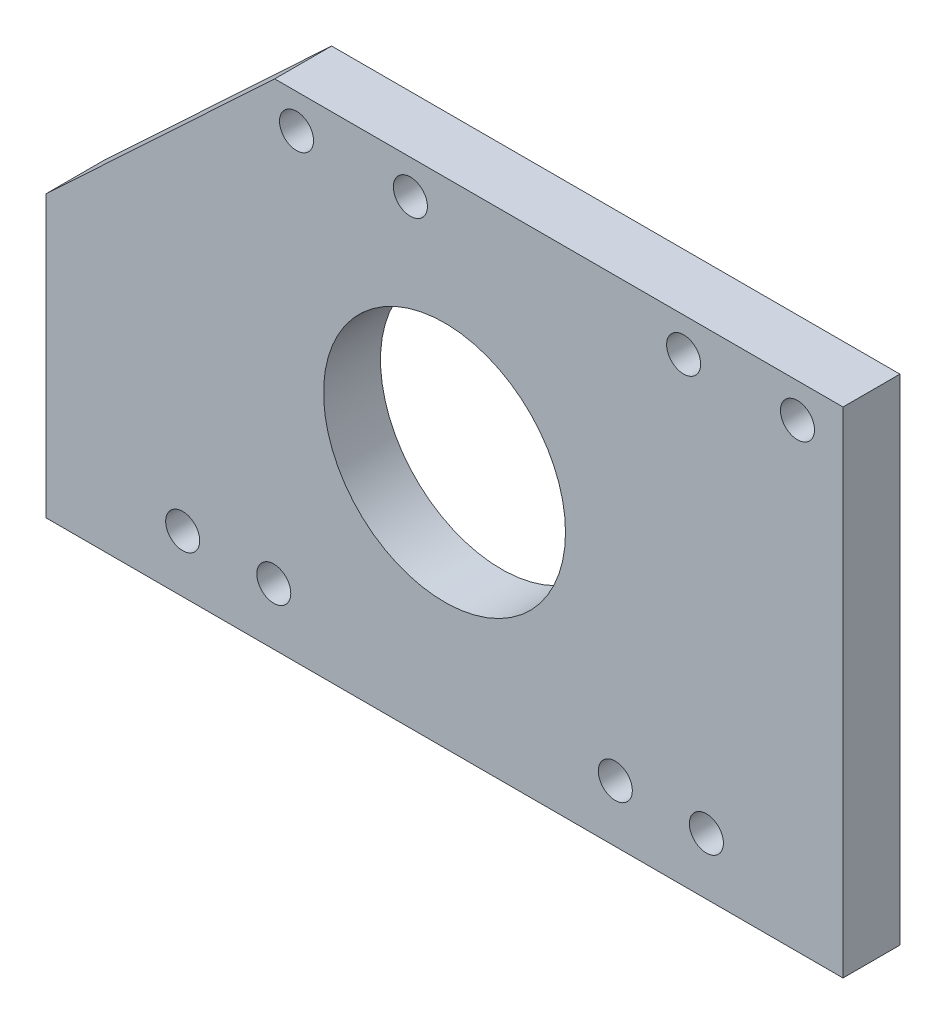
ISO-10303-21;
HEADER;
FILE_DESCRIPTION(('STEP AP214'),'2;1');
FILE_NAME('part.step','',(''),(''),'','','');
FILE_SCHEMA(('AUTOMOTIVE_DESIGN { 1 0 10303 214 1 1 1 1 }'));
ENDSEC;
DATA;
#1=APPLICATION_CONTEXT('core data for automotive mechanical design processes');
#2=APPLICATION_PROTOCOL_DEFINITION('international standard','automotive_design',2000,#1);
#3=PRODUCT_CONTEXT('',#1,'mechanical');
#4=PRODUCT('Part','Part','',(#3));
#5=PRODUCT_RELATED_PRODUCT_CATEGORY('part','',(#4));
#6=PRODUCT_DEFINITION_FORMATION('','',#4);
#7=PRODUCT_DEFINITION_CONTEXT('part definition',#1,'design');
#8=PRODUCT_DEFINITION('design','',#6,#7);
#9=PRODUCT_DEFINITION_SHAPE('','',#8);
#10=(LENGTH_UNIT() NAMED_UNIT(*) SI_UNIT(.MILLI.,.METRE.));
#11=(NAMED_UNIT(*) PLANE_ANGLE_UNIT() SI_UNIT($,.RADIAN.));
#12=(NAMED_UNIT(*) SI_UNIT($,.STERADIAN.) SOLID_ANGLE_UNIT());
#13=UNCERTAINTY_MEASURE_WITH_UNIT(LENGTH_MEASURE(1.E-05),#10,'distance_accuracy_value','');
#14=(GEOMETRIC_REPRESENTATION_CONTEXT(3) GLOBAL_UNCERTAINTY_ASSIGNED_CONTEXT((#13)) GLOBAL_UNIT_ASSIGNED_CONTEXT((#10,
#11,#12)) REPRESENTATION_CONTEXT('',''));
#15=CARTESIAN_POINT('',(0.,0.,0.));
#16=DIRECTION('',(0.,0.,1.));
#17=DIRECTION('',(1.,0.,0.));
#18=AXIS2_PLACEMENT_3D('',#15,#16,#17);
#19=CARTESIAN_POINT('',(-127.,0.,6.35));
#20=DIRECTION('',(-1.,0.,0.));
#21=DIRECTION('',(0.,0.,1.));
#22=AXIS2_PLACEMENT_3D('',#19,#20,#21);
#23=PLANE('',#22);
#24=DIRECTION('',(0.,0.,1.));
#25=VECTOR('',#24,1.);
#26=CARTESIAN_POINT('',(-127.,3.73361875617917,0.));
#27=LINE('',#26,#25);
#28=CARTESIAN_POINT('',(-127.,3.73361875617917,0.));
#29=VERTEX_POINT('',#28);
#30=CARTESIAN_POINT('',(-127.,3.73361875617917,6.35));
#31=VERTEX_POINT('',#30);
#32=EDGE_CURVE('E82',#29,#31,#27,.T.);
#33=ORIENTED_EDGE('',*,*,#32,.F.);
#34=DIRECTION('',(0.,1.,0.));
#35=VECTOR('',#34,1.);
#36=CARTESIAN_POINT('',(-127.,0.,0.));
#37=LINE('',#36,#35);
#38=CARTESIAN_POINT('',(-127.,-27.58186,0.));
#39=VERTEX_POINT('',#38);
#40=EDGE_CURVE('E94',#39,#29,#37,.T.);
#41=ORIENTED_EDGE('',*,*,#40,.F.);
#42=DIRECTION('',(0.,0.,-1.));
#43=VECTOR('',#42,1.);
#44=CARTESIAN_POINT('',(-127.,-27.58186,6.35));
#45=LINE('',#44,#43);
#46=CARTESIAN_POINT('',(-127.,-27.58186,6.35));
#47=VERTEX_POINT('',#46);
#48=EDGE_CURVE('E11',#47,#39,#45,.T.);
#49=ORIENTED_EDGE('',*,*,#48,.F.);
#50=DIRECTION('',(0.,1.,0.));
#51=VECTOR('',#50,1.);
#52=CARTESIAN_POINT('',(-127.,0.,6.35));
#53=LINE('',#52,#51);
#54=EDGE_CURVE('E96',#47,#31,#53,.T.);
#55=ORIENTED_EDGE('',*,*,#54,.T.);
#56=EDGE_LOOP('',(#33,#41,#49,#55));
#57=FACE_BOUND('',#56,.T.);
#58=ADVANCED_FACE('F35',(#57),#23,.T.);
#59=CARTESIAN_POINT('',(0.,-27.58186,6.35));
#60=DIRECTION('',(0.,-1.,0.));
#61=DIRECTION('',(1.,0.,0.));
#62=AXIS2_PLACEMENT_3D('',#59,#60,#61);
#63=PLANE('',#62);
#64=DIRECTION('',(0.,0.,1.));
#65=VECTOR('',#64,1.);
#66=CARTESIAN_POINT('',(-38.0999999999999,-27.58186,0.));
#67=LINE('',#66,#65);
#68=CARTESIAN_POINT('',(-38.0999999999999,-27.58186,0.));
#69=VERTEX_POINT('',#68);
#70=CARTESIAN_POINT('',(-38.0999999999999,-27.58186,6.35));
#71=VERTEX_POINT('',#70);
#72=EDGE_CURVE('E58',#69,#71,#67,.T.);
#73=ORIENTED_EDGE('',*,*,#72,.T.);
#74=DIRECTION('',(-1.,0.,0.));
#75=VECTOR('',#74,1.);
#76=CARTESIAN_POINT('',(0.,-27.58186,6.35));
#77=LINE('',#76,#75);
#78=EDGE_CURVE('E116',#71,#47,#77,.T.);
#79=ORIENTED_EDGE('',*,*,#78,.T.);
#80=ORIENTED_EDGE('',*,*,#48,.T.);
#81=DIRECTION('',(-1.,0.,0.));
#82=VECTOR('',#81,1.);
#83=CARTESIAN_POINT('',(0.,-27.58186,0.));
#84=LINE('',#83,#82);
#85=EDGE_CURVE('E100',#69,#39,#84,.T.);
#86=ORIENTED_EDGE('',*,*,#85,.F.);
#87=EDGE_LOOP('',(#73,#79,#80,#86));
#88=FACE_BOUND('',#87,.T.);
#89=ADVANCED_FACE('F180',(#88),#63,.T.);
#90=CARTESIAN_POINT('',(-82.5499999999999,0.,6.35));
#91=DIRECTION('',(0.,0.,-1.));
#92=DIRECTION('',(-1.,0.,0.));
#93=AXIS2_PLACEMENT_3D('',#90,#91,#92);
#94=CYLINDRICAL_SURFACE('',#93,13.49375);
#95=CARTESIAN_POINT('',(-82.5499999999999,0.,6.35));
#96=DIRECTION('',(0.,0.,1.));
#97=DIRECTION('',(1.,0.,0.));
#98=AXIS2_PLACEMENT_3D('',#95,#96,#97);
#99=CIRCLE('',#98,13.49375);
#100=CARTESIAN_POINT('',(-69.0562499999999,0.,6.35));
#101=VERTEX_POINT('',#100);
#102=EDGE_CURVE('E109',#101,#101,#99,.T.);
#103=ORIENTED_EDGE('',*,*,#102,.T.);
#104=EDGE_LOOP('',(#103));
#105=FACE_BOUND('',#104,.T.);
#106=CARTESIAN_POINT('',(-82.5499999999999,0.,0.));
#107=DIRECTION('',(0.,0.,1.));
#108=DIRECTION('',(1.,0.,0.));
#109=AXIS2_PLACEMENT_3D('',#106,#107,#108);
#110=CIRCLE('',#109,13.49375);
#111=CARTESIAN_POINT('',(-69.0562499999999,0.,0.));
#112=VERTEX_POINT('',#111);
#113=EDGE_CURVE('E101',#112,#112,#110,.T.);
#114=ORIENTED_EDGE('',*,*,#113,.F.);
#115=EDGE_LOOP('',(#114));
#116=FACE_BOUND('',#115,.T.);
#117=ADVANCED_FACE('F37',(#105,#116),#94,.F.);
#118=CARTESIAN_POINT('',(0.,27.58186,6.35));
#119=DIRECTION('',(0.,-1.,0.));
#120=DIRECTION('',(1.,0.,0.));
#121=AXIS2_PLACEMENT_3D('',#118,#119,#120);
#122=PLANE('',#121);
#123=DIRECTION('',(-1.,0.,0.));
#124=VECTOR('',#123,1.);
#125=CARTESIAN_POINT('',(0.,27.58186,0.));
#126=LINE('',#125,#124);
#127=CARTESIAN_POINT('',(-38.0999999999999,27.58186,0.));
#128=VERTEX_POINT('',#127);
#129=CARTESIAN_POINT('',(-101.496237284209,27.58186,0.));
#130=VERTEX_POINT('',#129);
#131=EDGE_CURVE('E103',#128,#130,#126,.T.);
#132=ORIENTED_EDGE('',*,*,#131,.T.);
#133=DIRECTION('',(0.,0.,1.));
#134=VECTOR('',#133,1.);
#135=CARTESIAN_POINT('',(-101.496237284209,27.58186,0.));
#136=LINE('',#135,#134);
#137=CARTESIAN_POINT('',(-101.496237284209,27.58186,6.35));
#138=VERTEX_POINT('',#137);
#139=EDGE_CURVE('E50',#130,#138,#136,.T.);
#140=ORIENTED_EDGE('',*,*,#139,.T.);
#141=DIRECTION('',(-1.,0.,0.));
#142=VECTOR('',#141,1.);
#143=CARTESIAN_POINT('',(0.,27.58186,6.35));
#144=LINE('',#143,#142);
#145=CARTESIAN_POINT('',(-38.0999999999999,27.58186,6.35));
#146=VERTEX_POINT('',#145);
#147=EDGE_CURVE('E43',#146,#138,#144,.T.);
#148=ORIENTED_EDGE('',*,*,#147,.F.);
#149=DIRECTION('',(0.,0.,1.));
#150=VECTOR('',#149,1.);
#151=CARTESIAN_POINT('',(-38.0999999999999,27.58186,0.));
#152=LINE('',#151,#150);
#153=EDGE_CURVE('E130',#128,#146,#152,.T.);
#154=ORIENTED_EDGE('',*,*,#153,.F.);
#155=EDGE_LOOP('',(#132,#140,#148,#154));
#156=FACE_BOUND('',#155,.T.);
#157=ADVANCED_FACE('F129',(#156),#122,.F.);
#158=CARTESIAN_POINT('',(0.,0.,6.35));
#159=DIRECTION('',(0.,0.,1.));
#160=DIRECTION('',(1.,0.,0.));
#161=AXIS2_PLACEMENT_3D('',#158,#159,#160);
#162=PLANE('',#161);
#163=CARTESIAN_POINT('',(-43.1799999999999,23.77186,6.35));
#164=DIRECTION('',(0.,0.,1.));
#165=DIRECTION('',(1.,0.,0.));
#166=AXIS2_PLACEMENT_3D('',#163,#164,#165);
#167=CIRCLE('',#166,1.89864999999999);
#168=CARTESIAN_POINT('',(-41.28135,23.77186,6.35));
#169=VERTEX_POINT('',#168);
#170=EDGE_CURVE('E195',#169,#169,#167,.T.);
#171=ORIENTED_EDGE('',*,*,#170,.F.);
#172=EDGE_LOOP('',(#171));
#173=FACE_BOUND('',#172,.T.);
#174=CARTESIAN_POINT('',(-55.8799999999999,23.77186,6.35));
#175=DIRECTION('',(0.,0.,1.));
#176=DIRECTION('',(1.,0.,0.));
#177=AXIS2_PLACEMENT_3D('',#174,#175,#176);
#178=CIRCLE('',#177,1.89864999999999);
#179=CARTESIAN_POINT('',(-53.98135,23.77186,6.35));
#180=VERTEX_POINT('',#179);
#181=EDGE_CURVE('E199',#180,#180,#178,.T.);
#182=ORIENTED_EDGE('',*,*,#181,.F.);
#183=EDGE_LOOP('',(#182));
#184=FACE_BOUND('',#183,.T.);
#185=CARTESIAN_POINT('',(-99.0599999999999,23.77186,6.35));
#186=DIRECTION('',(0.,0.,1.));
#187=DIRECTION('',(1.,0.,0.));
#188=AXIS2_PLACEMENT_3D('',#185,#186,#187);
#189=CIRCLE('',#188,1.89864999999999);
#190=CARTESIAN_POINT('',(-97.16135,23.77186,6.35));
#191=VERTEX_POINT('',#190);
#192=EDGE_CURVE('E203',#191,#191,#189,.T.);
#193=ORIENTED_EDGE('',*,*,#192,.F.);
#194=EDGE_LOOP('',(#193));
#195=FACE_BOUND('',#194,.T.);
#196=CARTESIAN_POINT('',(-86.3599999999999,23.77186,6.35));
#197=DIRECTION('',(0.,0.,1.));
#198=DIRECTION('',(1.,0.,0.));
#199=AXIS2_PLACEMENT_3D('',#196,#197,#198);
#200=CIRCLE('',#199,1.89864999999999);
#201=CARTESIAN_POINT('',(-84.46135,23.77186,6.35));
#202=VERTEX_POINT('',#201);
#203=EDGE_CURVE('E206',#202,#202,#200,.T.);
#204=ORIENTED_EDGE('',*,*,#203,.F.);
#205=EDGE_LOOP('',(#204));
#206=FACE_BOUND('',#205,.T.);
#207=DIRECTION('',(0.730415954768212,0.683002586393377,0.));
#208=VECTOR('',#207,1.);
#209=CARTESIAN_POINT('',(-127.,3.73361875617917,6.35));
#210=LINE('',#209,#208);
#211=EDGE_CURVE('E88',#31,#138,#210,.T.);
#212=ORIENTED_EDGE('',*,*,#211,.F.);
#213=ORIENTED_EDGE('',*,*,#54,.F.);
#214=ORIENTED_EDGE('',*,*,#78,.F.);
#215=DIRECTION('',(0.,-1.,0.));
#216=VECTOR('',#215,1.);
#217=CARTESIAN_POINT('',(-38.0999999999999,-27.58186,6.35));
#218=LINE('',#217,#216);
#219=EDGE_CURVE('E128',#146,#71,#218,.T.);
#220=ORIENTED_EDGE('',*,*,#219,.F.);
#221=ORIENTED_EDGE('',*,*,#147,.T.);
#222=EDGE_LOOP('',(#212,#213,#214,#220,#221));
#223=FACE_BOUND('',#222,.T.);
#224=CARTESIAN_POINT('',(-111.76,-21.23186,6.35));
#225=DIRECTION('',(0.,0.,1.));
#226=DIRECTION('',(1.,0.,0.));
#227=AXIS2_PLACEMENT_3D('',#224,#225,#226);
#228=CIRCLE('',#227,1.89865);
#229=CARTESIAN_POINT('',(-109.86135,-21.23186,6.35));
#230=VERTEX_POINT('',#229);
#231=EDGE_CURVE('E138',#230,#230,#228,.T.);
#232=ORIENTED_EDGE('',*,*,#231,.F.);
#233=EDGE_LOOP('',(#232));
#234=FACE_BOUND('',#233,.T.);
#235=CARTESIAN_POINT('',(-101.6,-21.23186,6.35));
#236=DIRECTION('',(0.,0.,1.));
#237=DIRECTION('',(1.,0.,0.));
#238=AXIS2_PLACEMENT_3D('',#235,#236,#237);
#239=CIRCLE('',#238,1.89865);
#240=CARTESIAN_POINT('',(-99.7013499999999,-21.23186,6.35));
#241=VERTEX_POINT('',#240);
#242=EDGE_CURVE('E145',#241,#241,#239,.T.);
#243=ORIENTED_EDGE('',*,*,#242,.F.);
#244=EDGE_LOOP('',(#243));
#245=FACE_BOUND('',#244,.T.);
#246=CARTESIAN_POINT('',(-63.4999999999999,-21.23186,6.35));
#247=DIRECTION('',(0.,0.,1.));
#248=DIRECTION('',(1.,0.,0.));
#249=AXIS2_PLACEMENT_3D('',#246,#247,#248);
#250=CIRCLE('',#249,1.89865);
#251=CARTESIAN_POINT('',(-61.6013499999999,-21.23186,6.35));
#252=VERTEX_POINT('',#251);
#253=EDGE_CURVE('E151',#252,#252,#250,.T.);
#254=ORIENTED_EDGE('',*,*,#253,.F.);
#255=EDGE_LOOP('',(#254));
#256=FACE_BOUND('',#255,.T.);
#257=CARTESIAN_POINT('',(-53.3399999999999,-21.23186,6.35));
#258=DIRECTION('',(0.,0.,1.));
#259=DIRECTION('',(1.,0.,0.));
#260=AXIS2_PLACEMENT_3D('',#257,#258,#259);
#261=CIRCLE('',#260,1.89865);
#262=CARTESIAN_POINT('',(-51.4413499999999,-21.23186,6.35));
#263=VERTEX_POINT('',#262);
#264=EDGE_CURVE('E156',#263,#263,#261,.T.);
#265=ORIENTED_EDGE('',*,*,#264,.F.);
#266=EDGE_LOOP('',(#265));
#267=FACE_BOUND('',#266,.T.);
#268=ORIENTED_EDGE('',*,*,#102,.F.);
#269=EDGE_LOOP('',(#268));
#270=FACE_BOUND('',#269,.T.);
#271=ADVANCED_FACE('F125',(#173,#184,#195,#206,#223,#234,#245,#256,#267,#270),#162,.T.);
#272=CARTESIAN_POINT('',(0.,0.,0.));
#273=DIRECTION('',(0.,0.,1.));
#274=DIRECTION('',(1.,0.,0.));
#275=AXIS2_PLACEMENT_3D('',#272,#273,#274);
#276=PLANE('',#275);
#277=CARTESIAN_POINT('',(-43.1799999999999,23.77186,0.));
#278=DIRECTION('',(0.,0.,1.));
#279=DIRECTION('',(1.,0.,0.));
#280=AXIS2_PLACEMENT_3D('',#277,#278,#279);
#281=CIRCLE('',#280,1.89864999999999);
#282=CARTESIAN_POINT('',(-41.28135,23.77186,0.));
#283=VERTEX_POINT('',#282);
#284=EDGE_CURVE('E221',#283,#283,#281,.T.);
#285=ORIENTED_EDGE('',*,*,#284,.T.);
#286=EDGE_LOOP('',(#285));
#287=FACE_BOUND('',#286,.T.);
#288=CARTESIAN_POINT('',(-55.8799999999999,23.77186,0.));
#289=DIRECTION('',(0.,0.,1.));
#290=DIRECTION('',(1.,0.,0.));
#291=AXIS2_PLACEMENT_3D('',#288,#289,#290);
#292=CIRCLE('',#291,1.89864999999999);
#293=CARTESIAN_POINT('',(-53.98135,23.77186,0.));
#294=VERTEX_POINT('',#293);
#295=EDGE_CURVE('E217',#294,#294,#292,.T.);
#296=ORIENTED_EDGE('',*,*,#295,.T.);
#297=EDGE_LOOP('',(#296));
#298=FACE_BOUND('',#297,.T.);
#299=CARTESIAN_POINT('',(-99.0599999999999,23.77186,0.));
#300=DIRECTION('',(0.,0.,1.));
#301=DIRECTION('',(1.,0.,0.));
#302=AXIS2_PLACEMENT_3D('',#299,#300,#301);
#303=CIRCLE('',#302,1.89864999999999);
#304=CARTESIAN_POINT('',(-97.16135,23.77186,0.));
#305=VERTEX_POINT('',#304);
#306=EDGE_CURVE('E209',#305,#305,#303,.T.);
#307=ORIENTED_EDGE('',*,*,#306,.T.);
#308=EDGE_LOOP('',(#307));
#309=FACE_BOUND('',#308,.T.);
#310=CARTESIAN_POINT('',(-86.3599999999999,23.77186,0.));
#311=DIRECTION('',(0.,0.,1.));
#312=DIRECTION('',(1.,0.,0.));
#313=AXIS2_PLACEMENT_3D('',#310,#311,#312);
#314=CIRCLE('',#313,1.89864999999999);
#315=CARTESIAN_POINT('',(-84.46135,23.77186,0.));
#316=VERTEX_POINT('',#315);
#317=EDGE_CURVE('E208',#316,#316,#314,.T.);
#318=ORIENTED_EDGE('',*,*,#317,.T.);
#319=EDGE_LOOP('',(#318));
#320=FACE_BOUND('',#319,.T.);
#321=CARTESIAN_POINT('',(-111.76,-21.23186,0.));
#322=DIRECTION('',(0.,0.,1.));
#323=DIRECTION('',(1.,0.,0.));
#324=AXIS2_PLACEMENT_3D('',#321,#322,#323);
#325=CIRCLE('',#324,1.89865);
#326=CARTESIAN_POINT('',(-109.86135,-21.23186,0.));
#327=VERTEX_POINT('',#326);
#328=EDGE_CURVE('E142',#327,#327,#325,.T.);
#329=ORIENTED_EDGE('',*,*,#328,.T.);
#330=EDGE_LOOP('',(#329));
#331=FACE_BOUND('',#330,.T.);
#332=CARTESIAN_POINT('',(-101.6,-21.23186,0.));
#333=DIRECTION('',(0.,0.,1.));
#334=DIRECTION('',(1.,0.,0.));
#335=AXIS2_PLACEMENT_3D('',#332,#333,#334);
#336=CIRCLE('',#335,1.89865);
#337=CARTESIAN_POINT('',(-99.7013499999999,-21.23186,0.));
#338=VERTEX_POINT('',#337);
#339=EDGE_CURVE('E148',#338,#338,#336,.T.);
#340=ORIENTED_EDGE('',*,*,#339,.T.);
#341=EDGE_LOOP('',(#340));
#342=FACE_BOUND('',#341,.T.);
#343=CARTESIAN_POINT('',(-63.4999999999999,-21.23186,0.));
#344=DIRECTION('',(0.,0.,1.));
#345=DIRECTION('',(1.,0.,0.));
#346=AXIS2_PLACEMENT_3D('',#343,#344,#345);
#347=CIRCLE('',#346,1.89865);
#348=CARTESIAN_POINT('',(-61.6013499999999,-21.23186,0.));
#349=VERTEX_POINT('',#348);
#350=EDGE_CURVE('E154',#349,#349,#347,.T.);
#351=ORIENTED_EDGE('',*,*,#350,.T.);
#352=EDGE_LOOP('',(#351));
#353=FACE_BOUND('',#352,.T.);
#354=CARTESIAN_POINT('',(-53.3399999999999,-21.23186,0.));
#355=DIRECTION('',(0.,0.,1.));
#356=DIRECTION('',(1.,0.,0.));
#357=AXIS2_PLACEMENT_3D('',#354,#355,#356);
#358=CIRCLE('',#357,1.89865);
#359=CARTESIAN_POINT('',(-51.4413499999999,-21.23186,0.));
#360=VERTEX_POINT('',#359);
#361=EDGE_CURVE('E106',#360,#360,#358,.T.);
#362=ORIENTED_EDGE('',*,*,#361,.T.);
#363=EDGE_LOOP('',(#362));
#364=FACE_BOUND('',#363,.T.);
#365=ORIENTED_EDGE('',*,*,#113,.T.);
#366=EDGE_LOOP('',(#365));
#367=FACE_BOUND('',#366,.T.);
#368=ORIENTED_EDGE('',*,*,#40,.T.);
#369=DIRECTION('',(0.730415954768212,0.683002586393377,0.));
#370=VECTOR('',#369,1.);
#371=CARTESIAN_POINT('',(-127.,3.73361875617917,0.));
#372=LINE('',#371,#370);
#373=EDGE_CURVE('E79',#29,#130,#372,.T.);
#374=ORIENTED_EDGE('',*,*,#373,.T.);
#375=ORIENTED_EDGE('',*,*,#131,.F.);
#376=DIRECTION('',(0.,-1.,0.));
#377=VECTOR('',#376,1.);
#378=CARTESIAN_POINT('',(-38.0999999999999,-27.58186,0.));
#379=LINE('',#378,#377);
#380=EDGE_CURVE('E132',#128,#69,#379,.T.);
#381=ORIENTED_EDGE('',*,*,#380,.T.);
#382=ORIENTED_EDGE('',*,*,#85,.T.);
#383=EDGE_LOOP('',(#368,#374,#375,#381,#382));
#384=FACE_BOUND('',#383,.T.);
#385=ADVANCED_FACE('F98',(#287,#298,#309,#320,#331,#342,#353,#364,#367,#384),#276,.F.);
#386=CARTESIAN_POINT('',(-53.3399999999999,-21.23186,6.35));
#387=DIRECTION('',(0.,0.,1.));
#388=DIRECTION('',(1.,0.,0.));
#389=AXIS2_PLACEMENT_3D('',#386,#387,#388);
#390=CYLINDRICAL_SURFACE('',#389,1.89865);
#391=ORIENTED_EDGE('',*,*,#361,.F.);
#392=EDGE_LOOP('',(#391));
#393=FACE_BOUND('',#392,.T.);
#394=ORIENTED_EDGE('',*,*,#264,.T.);
#395=EDGE_LOOP('',(#394));
#396=FACE_BOUND('',#395,.T.);
#397=ADVANCED_FACE('F165',(#393,#396),#390,.F.);
#398=CARTESIAN_POINT('',(-63.4999999999999,-21.23186,6.35));
#399=DIRECTION('',(0.,0.,1.));
#400=DIRECTION('',(1.,0.,0.));
#401=AXIS2_PLACEMENT_3D('',#398,#399,#400);
#402=CYLINDRICAL_SURFACE('',#401,1.89865);
#403=ORIENTED_EDGE('',*,*,#350,.F.);
#404=EDGE_LOOP('',(#403));
#405=FACE_BOUND('',#404,.T.);
#406=ORIENTED_EDGE('',*,*,#253,.T.);
#407=EDGE_LOOP('',(#406));
#408=FACE_BOUND('',#407,.T.);
#409=ADVANCED_FACE('F167',(#405,#408),#402,.F.);
#410=CARTESIAN_POINT('',(-101.6,-21.23186,6.35));
#411=DIRECTION('',(0.,0.,1.));
#412=DIRECTION('',(1.,0.,0.));
#413=AXIS2_PLACEMENT_3D('',#410,#411,#412);
#414=CYLINDRICAL_SURFACE('',#413,1.89865);
#415=ORIENTED_EDGE('',*,*,#339,.F.);
#416=EDGE_LOOP('',(#415));
#417=FACE_BOUND('',#416,.T.);
#418=ORIENTED_EDGE('',*,*,#242,.T.);
#419=EDGE_LOOP('',(#418));
#420=FACE_BOUND('',#419,.T.);
#421=ADVANCED_FACE('F173',(#417,#420),#414,.F.);
#422=CARTESIAN_POINT('',(-111.76,-21.23186,6.35));
#423=DIRECTION('',(0.,0.,1.));
#424=DIRECTION('',(1.,0.,0.));
#425=AXIS2_PLACEMENT_3D('',#422,#423,#424);
#426=CYLINDRICAL_SURFACE('',#425,1.89865);
#427=ORIENTED_EDGE('',*,*,#328,.F.);
#428=EDGE_LOOP('',(#427));
#429=FACE_BOUND('',#428,.T.);
#430=ORIENTED_EDGE('',*,*,#231,.T.);
#431=EDGE_LOOP('',(#430));
#432=FACE_BOUND('',#431,.T.);
#433=ADVANCED_FACE('F250',(#429,#432),#426,.F.);
#434=CARTESIAN_POINT('',(-38.0999999999999,-27.58186,0.));
#435=DIRECTION('',(-1.,0.,0.));
#436=DIRECTION('',(0.,-1.,0.));
#437=AXIS2_PLACEMENT_3D('',#434,#435,#436);
#438=PLANE('',#437);
#439=ORIENTED_EDGE('',*,*,#219,.T.);
#440=ORIENTED_EDGE('',*,*,#72,.F.);
#441=ORIENTED_EDGE('',*,*,#380,.F.);
#442=ORIENTED_EDGE('',*,*,#153,.T.);
#443=EDGE_LOOP('',(#439,#440,#441,#442));
#444=FACE_BOUND('',#443,.T.);
#445=ADVANCED_FACE('F247',(#444),#438,.F.);
#446=CARTESIAN_POINT('',(-127.,3.73361875617917,0.));
#447=DIRECTION('',(0.683002586393377,-0.730415954768212,0.));
#448=DIRECTION('',(0.730415954768212,0.683002586393377,0.));
#449=AXIS2_PLACEMENT_3D('',#446,#447,#448);
#450=PLANE('',#449);
#451=ORIENTED_EDGE('',*,*,#211,.T.);
#452=ORIENTED_EDGE('',*,*,#139,.F.);
#453=ORIENTED_EDGE('',*,*,#373,.F.);
#454=ORIENTED_EDGE('',*,*,#32,.T.);
#455=EDGE_LOOP('',(#451,#452,#453,#454));
#456=FACE_BOUND('',#455,.T.);
#457=ADVANCED_FACE('F81',(#456),#450,.F.);
#458=CARTESIAN_POINT('',(-86.3599999999999,23.77186,6.35));
#459=DIRECTION('',(0.,0.,1.));
#460=DIRECTION('',(1.,0.,0.));
#461=AXIS2_PLACEMENT_3D('',#458,#459,#460);
#462=CYLINDRICAL_SURFACE('',#461,1.89864999999999);
#463=ORIENTED_EDGE('',*,*,#317,.F.);
#464=EDGE_LOOP('',(#463));
#465=FACE_BOUND('',#464,.T.);
#466=ORIENTED_EDGE('',*,*,#203,.T.);
#467=EDGE_LOOP('',(#466));
#468=FACE_BOUND('',#467,.T.);
#469=ADVANCED_FACE('F240',(#465,#468),#462,.F.);
#470=CARTESIAN_POINT('',(-99.0599999999999,23.77186,6.35));
#471=DIRECTION('',(0.,0.,1.));
#472=DIRECTION('',(1.,0.,0.));
#473=AXIS2_PLACEMENT_3D('',#470,#471,#472);
#474=CYLINDRICAL_SURFACE('',#473,1.89864999999999);
#475=ORIENTED_EDGE('',*,*,#306,.F.);
#476=EDGE_LOOP('',(#475));
#477=FACE_BOUND('',#476,.T.);
#478=ORIENTED_EDGE('',*,*,#192,.T.);
#479=EDGE_LOOP('',(#478));
#480=FACE_BOUND('',#479,.T.);
#481=ADVANCED_FACE('F233',(#477,#480),#474,.F.);
#482=CARTESIAN_POINT('',(-55.8799999999999,23.77186,6.35));
#483=DIRECTION('',(0.,0.,1.));
#484=DIRECTION('',(1.,0.,0.));
#485=AXIS2_PLACEMENT_3D('',#482,#483,#484);
#486=CYLINDRICAL_SURFACE('',#485,1.89864999999999);
#487=ORIENTED_EDGE('',*,*,#295,.F.);
#488=EDGE_LOOP('',(#487));
#489=FACE_BOUND('',#488,.T.);
#490=ORIENTED_EDGE('',*,*,#181,.T.);
#491=EDGE_LOOP('',(#490));
#492=FACE_BOUND('',#491,.T.);
#493=ADVANCED_FACE('F227',(#489,#492),#486,.F.);
#494=CARTESIAN_POINT('',(-43.1799999999999,23.77186,6.35));
#495=DIRECTION('',(0.,0.,1.));
#496=DIRECTION('',(1.,0.,0.));
#497=AXIS2_PLACEMENT_3D('',#494,#495,#496);
#498=CYLINDRICAL_SURFACE('',#497,1.89864999999999);
#499=ORIENTED_EDGE('',*,*,#284,.F.);
#500=EDGE_LOOP('',(#499));
#501=FACE_BOUND('',#500,.T.);
#502=ORIENTED_EDGE('',*,*,#170,.T.);
#503=EDGE_LOOP('',(#502));
#504=FACE_BOUND('',#503,.T.);
#505=ADVANCED_FACE('F225',(#501,#504),#498,.F.);
#506=CLOSED_SHELL('',(#58,#89,#117,#157,#271,#385,#397,#409,#421,#433,#445,#457,#469,#481,#493,#505));
#507=MANIFOLD_SOLID_BREP('B2',#506);
#508=ADVANCED_BREP_SHAPE_REPRESENTATION('',(#18,#507),#14);
#509=SHAPE_DEFINITION_REPRESENTATION(#9,#508);
ENDSEC;
END-ISO-10303-21;
